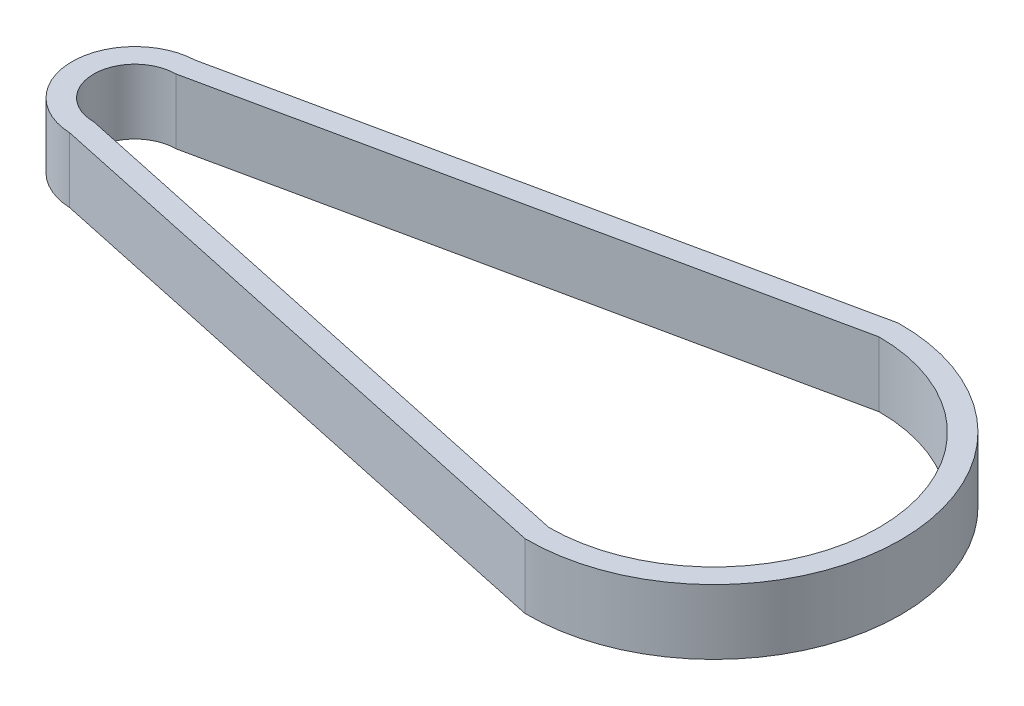
ISO-10303-21;
HEADER;
FILE_DESCRIPTION(('STEP AP214'),'2;1');
FILE_NAME('part.step','',(''),(''),'','','');
FILE_SCHEMA(('AUTOMOTIVE_DESIGN { 1 0 10303 214 1 1 1 1 }'));
ENDSEC;
DATA;
#1=APPLICATION_CONTEXT('core data for automotive mechanical design processes');
#2=APPLICATION_PROTOCOL_DEFINITION('international standard','automotive_design',2000,#1);
#3=PRODUCT_CONTEXT('',#1,'mechanical');
#4=PRODUCT('Part','Part','',(#3));
#5=PRODUCT_RELATED_PRODUCT_CATEGORY('part','',(#4));
#6=PRODUCT_DEFINITION_FORMATION('','',#4);
#7=PRODUCT_DEFINITION_CONTEXT('part definition',#1,'design');
#8=PRODUCT_DEFINITION('design','',#6,#7);
#9=PRODUCT_DEFINITION_SHAPE('','',#8);
#10=(LENGTH_UNIT() NAMED_UNIT(*) SI_UNIT(.MILLI.,.METRE.));
#11=(NAMED_UNIT(*) PLANE_ANGLE_UNIT() SI_UNIT($,.RADIAN.));
#12=(NAMED_UNIT(*) SI_UNIT($,.STERADIAN.) SOLID_ANGLE_UNIT());
#13=UNCERTAINTY_MEASURE_WITH_UNIT(LENGTH_MEASURE(1.E-05),#10,'distance_accuracy_value','');
#14=(GEOMETRIC_REPRESENTATION_CONTEXT(3) GLOBAL_UNCERTAINTY_ASSIGNED_CONTEXT((#13)) GLOBAL_UNIT_ASSIGNED_CONTEXT((#10,
#11,#12)) REPRESENTATION_CONTEXT('',''));
#15=CARTESIAN_POINT('',(0.,0.,0.));
#16=DIRECTION('',(0.,0.,1.));
#17=DIRECTION('',(1.,0.,0.));
#18=AXIS2_PLACEMENT_3D('',#15,#16,#17);
#19=CARTESIAN_POINT('',(0.,15.,0.));
#20=DIRECTION('',(0.,1.,0.));
#21=DIRECTION('',(0.,0.,1.));
#22=AXIS2_PLACEMENT_3D('',#19,#20,#21);
#23=PLANE('',#22);
#24=CARTESIAN_POINT('',(0.,15.,0.));
#25=DIRECTION('',(0.,1.,0.));
#26=DIRECTION('',(0.,0.,1.));
#27=AXIS2_PLACEMENT_3D('',#24,#25,#26);
#28=CIRCLE('',#27,14.55);
#29=CARTESIAN_POINT('',(-0.583159734212364,15.,-14.5383088674162));
#30=VERTEX_POINT('',#29);
#31=CARTESIAN_POINT('',(-0.583159734212364,15.,14.5383088674162));
#32=VERTEX_POINT('',#31);
#33=EDGE_CURVE('E153',#30,#32,#28,.T.);
#34=ORIENTED_EDGE('',*,*,#33,.T.);
#35=DIRECTION('',(0.977904293145221,0.,0.209053087631217));
#36=VECTOR('',#35,1.);
#37=CARTESIAN_POINT('',(-0.583159734212364,15.,14.5383088674162));
#38=LINE('',#37,#36);
#39=CARTESIAN_POINT('',(133.450472992086,15.,43.1915676415855));
#40=VERTEX_POINT('',#39);
#41=EDGE_CURVE('E157',#32,#40,#38,.T.);
#42=ORIENTED_EDGE('',*,*,#41,.T.);
#43=CARTESIAN_POINT('',(133.995,15.,0.));
#44=DIRECTION('',(0.,1.,0.));
#45=DIRECTION('',(0.,0.,1.));
#46=AXIS2_PLACEMENT_3D('',#43,#44,#45);
#47=CIRCLE('',#46,43.195);
#48=CARTESIAN_POINT('',(133.450472992086,15.,-43.1915676415855));
#49=VERTEX_POINT('',#48);
#50=EDGE_CURVE('E161',#40,#49,#47,.T.);
#51=ORIENTED_EDGE('',*,*,#50,.T.);
#52=DIRECTION('',(-0.977904293145221,0.,0.209053087631217));
#53=VECTOR('',#52,1.);
#54=CARTESIAN_POINT('',(-0.583159734212364,15.,-14.5383088674162));
#55=LINE('',#54,#53);
#56=EDGE_CURVE('E164',#49,#30,#55,.T.);
#57=ORIENTED_EDGE('',*,*,#56,.T.);
#58=EDGE_LOOP('',(#34,#42,#51,#57));
#59=FACE_BOUND('',#58,.T.);
#60=DIRECTION('',(0.977904293145221,0.,0.209053087631217));
#61=VECTOR('',#60,1.);
#62=CARTESIAN_POINT('',(0.,15.,9.55));
#63=LINE('',#62,#61);
#64=CARTESIAN_POINT('',(0.,15.,9.55));
#65=VERTEX_POINT('',#64);
#66=CARTESIAN_POINT('',(133.995,15.,38.195));
#67=VERTEX_POINT('',#66);
#68=EDGE_CURVE('E114',#65,#67,#63,.T.);
#69=ORIENTED_EDGE('',*,*,#68,.F.);
#70=CARTESIAN_POINT('',(0.,15.,0.));
#71=DIRECTION('',(0.,1.,0.));
#72=DIRECTION('',(0.,0.,1.));
#73=AXIS2_PLACEMENT_3D('',#70,#71,#72);
#74=CIRCLE('',#73,9.55);
#75=CARTESIAN_POINT('',(0.,15.,-9.55));
#76=VERTEX_POINT('',#75);
#77=EDGE_CURVE('E105',#76,#65,#74,.T.);
#78=ORIENTED_EDGE('',*,*,#77,.F.);
#79=DIRECTION('',(-0.977904293145221,0.,0.209053087631217));
#80=VECTOR('',#79,1.);
#81=CARTESIAN_POINT('',(0.,15.,-9.55));
#82=LINE('',#81,#80);
#83=CARTESIAN_POINT('',(133.995,15.,-38.195));
#84=VERTEX_POINT('',#83);
#85=EDGE_CURVE('E131',#84,#76,#82,.T.);
#86=ORIENTED_EDGE('',*,*,#85,.F.);
#87=CARTESIAN_POINT('',(133.995,15.,0.));
#88=DIRECTION('',(0.,1.,0.));
#89=DIRECTION('',(0.,0.,1.));
#90=AXIS2_PLACEMENT_3D('',#87,#88,#89);
#91=CIRCLE('',#90,38.195);
#92=EDGE_CURVE('E127',#67,#84,#91,.T.);
#93=ORIENTED_EDGE('',*,*,#92,.F.);
#94=EDGE_LOOP('',(#69,#78,#86,#93));
#95=FACE_BOUND('',#94,.T.);
#96=ADVANCED_FACE('F39',(#59,#95),#23,.T.);
#97=CARTESIAN_POINT('',(0.,0.,0.));
#98=DIRECTION('',(0.,1.,0.));
#99=DIRECTION('',(0.,0.,1.));
#100=AXIS2_PLACEMENT_3D('',#97,#98,#99);
#101=PLANE('',#100);
#102=CARTESIAN_POINT('',(0.,0.,0.));
#103=DIRECTION('',(0.,1.,0.));
#104=DIRECTION('',(0.,0.,1.));
#105=AXIS2_PLACEMENT_3D('',#102,#103,#104);
#106=CIRCLE('',#105,14.55);
#107=CARTESIAN_POINT('',(-0.583159734212364,0.,-14.5383088674162));
#108=VERTEX_POINT('',#107);
#109=CARTESIAN_POINT('',(-0.583159734212364,0.,14.5383088674162));
#110=VERTEX_POINT('',#109);
#111=EDGE_CURVE('E123',#108,#110,#106,.T.);
#112=ORIENTED_EDGE('',*,*,#111,.F.);
#113=DIRECTION('',(-0.977904293145221,0.,0.209053087631217));
#114=VECTOR('',#113,1.);
#115=CARTESIAN_POINT('',(-0.583159734212364,0.,-14.5383088674162));
#116=LINE('',#115,#114);
#117=CARTESIAN_POINT('',(133.450472992086,0.,-43.1915676415855));
#118=VERTEX_POINT('',#117);
#119=EDGE_CURVE('E158',#118,#108,#116,.T.);
#120=ORIENTED_EDGE('',*,*,#119,.F.);
#121=CARTESIAN_POINT('',(133.995,0.,0.));
#122=DIRECTION('',(0.,1.,0.));
#123=DIRECTION('',(0.,0.,1.));
#124=AXIS2_PLACEMENT_3D('',#121,#122,#123);
#125=CIRCLE('',#124,43.195);
#126=CARTESIAN_POINT('',(133.450472992086,0.,43.1915676415855));
#127=VERTEX_POINT('',#126);
#128=EDGE_CURVE('E174',#127,#118,#125,.T.);
#129=ORIENTED_EDGE('',*,*,#128,.F.);
#130=DIRECTION('',(0.977904293145221,0.,0.209053087631217));
#131=VECTOR('',#130,1.);
#132=CARTESIAN_POINT('',(-0.583159734212364,0.,14.5383088674162));
#133=LINE('',#132,#131);
#134=EDGE_CURVE('E171',#110,#127,#133,.T.);
#135=ORIENTED_EDGE('',*,*,#134,.F.);
#136=EDGE_LOOP('',(#112,#120,#129,#135));
#137=FACE_BOUND('',#136,.T.);
#138=CARTESIAN_POINT('',(0.,0.,0.));
#139=DIRECTION('',(0.,1.,0.));
#140=DIRECTION('',(0.,0.,1.));
#141=AXIS2_PLACEMENT_3D('',#138,#139,#140);
#142=CIRCLE('',#141,9.55);
#143=CARTESIAN_POINT('',(0.,0.,-9.55));
#144=VERTEX_POINT('',#143);
#145=CARTESIAN_POINT('',(0.,0.,9.55));
#146=VERTEX_POINT('',#145);
#147=EDGE_CURVE('E63',#144,#146,#142,.T.);
#148=ORIENTED_EDGE('',*,*,#147,.T.);
#149=DIRECTION('',(0.977904293145221,0.,0.209053087631217));
#150=VECTOR('',#149,1.);
#151=CARTESIAN_POINT('',(0.,0.,9.55));
#152=LINE('',#151,#150);
#153=CARTESIAN_POINT('',(133.995,0.,38.195));
#154=VERTEX_POINT('',#153);
#155=EDGE_CURVE('E121',#146,#154,#152,.T.);
#156=ORIENTED_EDGE('',*,*,#155,.T.);
#157=CARTESIAN_POINT('',(133.995,0.,0.));
#158=DIRECTION('',(0.,1.,0.));
#159=DIRECTION('',(0.,0.,1.));
#160=AXIS2_PLACEMENT_3D('',#157,#158,#159);
#161=CIRCLE('',#160,38.195);
#162=CARTESIAN_POINT('',(133.995,0.,-38.195));
#163=VERTEX_POINT('',#162);
#164=EDGE_CURVE('E140',#154,#163,#161,.T.);
#165=ORIENTED_EDGE('',*,*,#164,.T.);
#166=DIRECTION('',(-0.977904293145221,0.,0.209053087631217));
#167=VECTOR('',#166,1.);
#168=CARTESIAN_POINT('',(0.,0.,-9.55));
#169=LINE('',#168,#167);
#170=EDGE_CURVE('E115',#163,#144,#169,.T.);
#171=ORIENTED_EDGE('',*,*,#170,.T.);
#172=EDGE_LOOP('',(#148,#156,#165,#171));
#173=FACE_BOUND('',#172,.T.);
#174=ADVANCED_FACE('F197',(#137,#173),#101,.F.);
#175=CARTESIAN_POINT('',(0.,15.,0.));
#176=DIRECTION('',(0.,-1.,0.));
#177=DIRECTION('',(0.,0.,-1.));
#178=AXIS2_PLACEMENT_3D('',#175,#176,#177);
#179=CYLINDRICAL_SURFACE('',#178,14.55);
#180=ORIENTED_EDGE('',*,*,#111,.T.);
#181=DIRECTION('',(0.,-1.,0.));
#182=VECTOR('',#181,1.);
#183=CARTESIAN_POINT('',(-0.583159734212364,15.,14.5383088674162));
#184=LINE('',#183,#182);
#185=EDGE_CURVE('E11',#32,#110,#184,.T.);
#186=ORIENTED_EDGE('',*,*,#185,.F.);
#187=ORIENTED_EDGE('',*,*,#33,.F.);
#188=DIRECTION('',(0.,-1.,0.));
#189=VECTOR('',#188,1.);
#190=CARTESIAN_POINT('',(-0.583159734212364,15.,-14.5383088674162));
#191=LINE('',#190,#189);
#192=EDGE_CURVE('E167',#30,#108,#191,.T.);
#193=ORIENTED_EDGE('',*,*,#192,.T.);
#194=EDGE_LOOP('',(#180,#186,#187,#193));
#195=FACE_BOUND('',#194,.T.);
#196=ADVANCED_FACE('F41',(#195),#179,.T.);
#197=CARTESIAN_POINT('',(-0.583159734212364,15.,14.5383088674162));
#198=DIRECTION('',(0.209053087631217,0.,-0.977904293145221));
#199=DIRECTION('',(-0.977904293145221,0.,-0.209053087631217));
#200=AXIS2_PLACEMENT_3D('',#197,#198,#199);
#201=PLANE('',#200);
#202=ORIENTED_EDGE('',*,*,#134,.T.);
#203=DIRECTION('',(0.,-1.,0.));
#204=VECTOR('',#203,1.);
#205=CARTESIAN_POINT('',(133.450472992086,15.,43.1915676415855));
#206=LINE('',#205,#204);
#207=EDGE_CURVE('E48',#40,#127,#206,.T.);
#208=ORIENTED_EDGE('',*,*,#207,.F.);
#209=ORIENTED_EDGE('',*,*,#41,.F.);
#210=ORIENTED_EDGE('',*,*,#185,.T.);
#211=EDGE_LOOP('',(#202,#208,#209,#210));
#212=FACE_BOUND('',#211,.T.);
#213=ADVANCED_FACE('F207',(#212),#201,.F.);
#214=CARTESIAN_POINT('',(133.995,15.,0.));
#215=DIRECTION('',(0.,-1.,0.));
#216=DIRECTION('',(0.,0.,-1.));
#217=AXIS2_PLACEMENT_3D('',#214,#215,#216);
#218=CYLINDRICAL_SURFACE('',#217,43.195);
#219=ORIENTED_EDGE('',*,*,#128,.T.);
#220=DIRECTION('',(0.,-1.,0.));
#221=VECTOR('',#220,1.);
#222=CARTESIAN_POINT('',(133.450472992086,15.,-43.1915676415855));
#223=LINE('',#222,#221);
#224=EDGE_CURVE('E182',#49,#118,#223,.T.);
#225=ORIENTED_EDGE('',*,*,#224,.F.);
#226=ORIENTED_EDGE('',*,*,#50,.F.);
#227=ORIENTED_EDGE('',*,*,#207,.T.);
#228=EDGE_LOOP('',(#219,#225,#226,#227));
#229=FACE_BOUND('',#228,.T.);
#230=ADVANCED_FACE('F191',(#229),#218,.T.);
#231=CARTESIAN_POINT('',(-0.583159734212364,15.,-14.5383088674162));
#232=DIRECTION('',(0.209053087631217,0.,0.977904293145221));
#233=DIRECTION('',(0.977904293145221,0.,-0.209053087631217));
#234=AXIS2_PLACEMENT_3D('',#231,#232,#233);
#235=PLANE('',#234);
#236=ORIENTED_EDGE('',*,*,#119,.T.);
#237=ORIENTED_EDGE('',*,*,#192,.F.);
#238=ORIENTED_EDGE('',*,*,#56,.F.);
#239=ORIENTED_EDGE('',*,*,#224,.T.);
#240=EDGE_LOOP('',(#236,#237,#238,#239));
#241=FACE_BOUND('',#240,.T.);
#242=ADVANCED_FACE('F201',(#241),#235,.F.);
#243=CARTESIAN_POINT('',(0.,15.,0.));
#244=DIRECTION('',(0.,-1.,0.));
#245=DIRECTION('',(0.,0.,-1.));
#246=AXIS2_PLACEMENT_3D('',#243,#244,#245);
#247=CYLINDRICAL_SURFACE('',#246,9.55);
#248=ORIENTED_EDGE('',*,*,#147,.F.);
#249=DIRECTION('',(0.,-1.,0.));
#250=VECTOR('',#249,1.);
#251=CARTESIAN_POINT('',(0.,15.,-9.55));
#252=LINE('',#251,#250);
#253=EDGE_CURVE('E109',#76,#144,#252,.T.);
#254=ORIENTED_EDGE('',*,*,#253,.F.);
#255=ORIENTED_EDGE('',*,*,#77,.T.);
#256=DIRECTION('',(0.,-1.,0.));
#257=VECTOR('',#256,1.);
#258=CARTESIAN_POINT('',(0.,15.,9.55));
#259=LINE('',#258,#257);
#260=EDGE_CURVE('E108',#65,#146,#259,.T.);
#261=ORIENTED_EDGE('',*,*,#260,.T.);
#262=EDGE_LOOP('',(#248,#254,#255,#261));
#263=FACE_BOUND('',#262,.T.);
#264=ADVANCED_FACE('F107',(#263),#247,.F.);
#265=CARTESIAN_POINT('',(0.,15.,9.55));
#266=DIRECTION('',(0.209053087631217,0.,-0.977904293145221));
#267=DIRECTION('',(-0.977904293145221,0.,-0.209053087631217));
#268=AXIS2_PLACEMENT_3D('',#265,#266,#267);
#269=PLANE('',#268);
#270=ORIENTED_EDGE('',*,*,#155,.F.);
#271=ORIENTED_EDGE('',*,*,#260,.F.);
#272=ORIENTED_EDGE('',*,*,#68,.T.);
#273=DIRECTION('',(0.,-1.,0.));
#274=VECTOR('',#273,1.);
#275=CARTESIAN_POINT('',(133.995,15.,38.195));
#276=LINE('',#275,#274);
#277=EDGE_CURVE('E124',#67,#154,#276,.T.);
#278=ORIENTED_EDGE('',*,*,#277,.T.);
#279=EDGE_LOOP('',(#270,#271,#272,#278));
#280=FACE_BOUND('',#279,.T.);
#281=ADVANCED_FACE('F118',(#280),#269,.T.);
#282=CARTESIAN_POINT('',(133.995,15.,0.));
#283=DIRECTION('',(0.,-1.,0.));
#284=DIRECTION('',(0.,0.,-1.));
#285=AXIS2_PLACEMENT_3D('',#282,#283,#284);
#286=CYLINDRICAL_SURFACE('',#285,38.195);
#287=ORIENTED_EDGE('',*,*,#164,.F.);
#288=ORIENTED_EDGE('',*,*,#277,.F.);
#289=ORIENTED_EDGE('',*,*,#92,.T.);
#290=DIRECTION('',(0.,-1.,0.));
#291=VECTOR('',#290,1.);
#292=CARTESIAN_POINT('',(133.995,15.,-38.195));
#293=LINE('',#292,#291);
#294=EDGE_CURVE('E55',#84,#163,#293,.T.);
#295=ORIENTED_EDGE('',*,*,#294,.T.);
#296=EDGE_LOOP('',(#287,#288,#289,#295));
#297=FACE_BOUND('',#296,.T.);
#298=ADVANCED_FACE('F230',(#297),#286,.F.);
#299=CARTESIAN_POINT('',(0.,15.,-9.55));
#300=DIRECTION('',(0.209053087631217,0.,0.977904293145221));
#301=DIRECTION('',(0.977904293145221,0.,-0.209053087631217));
#302=AXIS2_PLACEMENT_3D('',#299,#300,#301);
#303=PLANE('',#302);
#304=ORIENTED_EDGE('',*,*,#170,.F.);
#305=ORIENTED_EDGE('',*,*,#294,.F.);
#306=ORIENTED_EDGE('',*,*,#85,.T.);
#307=ORIENTED_EDGE('',*,*,#253,.T.);
#308=EDGE_LOOP('',(#304,#305,#306,#307));
#309=FACE_BOUND('',#308,.T.);
#310=ADVANCED_FACE('F234',(#309),#303,.T.);
#311=CLOSED_SHELL('',(#96,#174,#196,#213,#230,#242,#264,#281,#298,#310));
#312=MANIFOLD_SOLID_BREP('B2',#311);
#313=ADVANCED_BREP_SHAPE_REPRESENTATION('',(#18,#312),#14);
#314=SHAPE_DEFINITION_REPRESENTATION(#9,#313);
ENDSEC;
END-ISO-10303-21;
